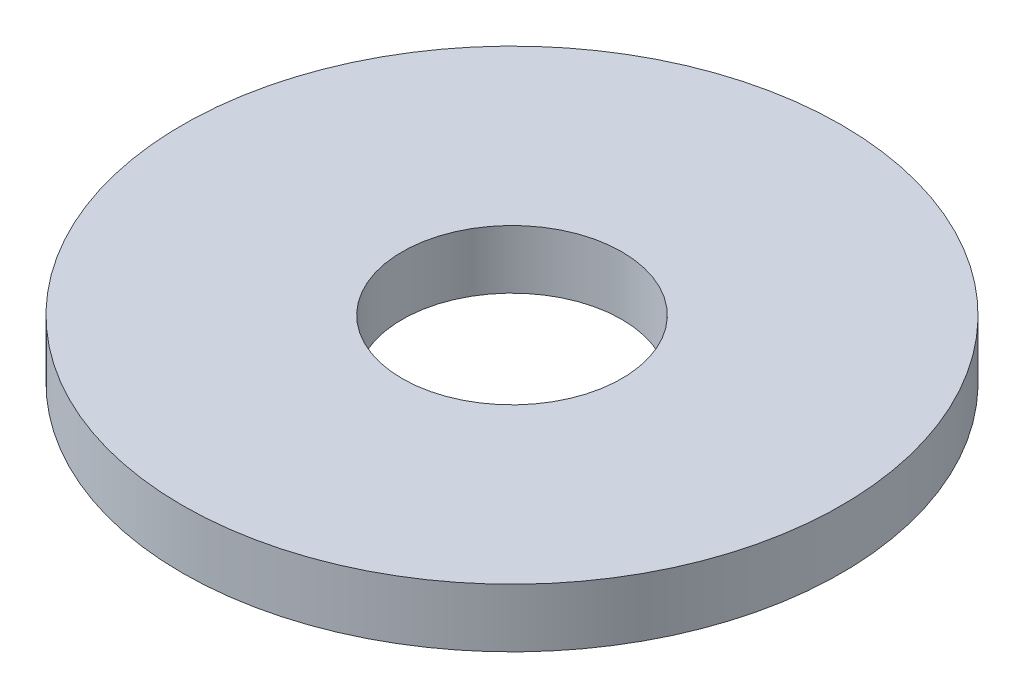
ISO-10303-21;
HEADER;
FILE_DESCRIPTION(('STEP AP214'),'2;1');
FILE_NAME('part.step','',(''),(''),'','','');
FILE_SCHEMA(('AUTOMOTIVE_DESIGN { 1 0 10303 214 1 1 1 1 }'));
ENDSEC;
DATA;
#1=APPLICATION_CONTEXT('core data for automotive mechanical design processes');
#2=APPLICATION_PROTOCOL_DEFINITION('international standard','automotive_design',2000,#1);
#3=PRODUCT_CONTEXT('',#1,'mechanical');
#4=PRODUCT('Part','Part','',(#3));
#5=PRODUCT_RELATED_PRODUCT_CATEGORY('part','',(#4));
#6=PRODUCT_DEFINITION_FORMATION('','',#4);
#7=PRODUCT_DEFINITION_CONTEXT('part definition',#1,'design');
#8=PRODUCT_DEFINITION('design','',#6,#7);
#9=PRODUCT_DEFINITION_SHAPE('','',#8);
#10=(LENGTH_UNIT() NAMED_UNIT(*) SI_UNIT(.MILLI.,.METRE.));
#11=(NAMED_UNIT(*) PLANE_ANGLE_UNIT() SI_UNIT($,.RADIAN.));
#12=(NAMED_UNIT(*) SI_UNIT($,.STERADIAN.) SOLID_ANGLE_UNIT());
#13=UNCERTAINTY_MEASURE_WITH_UNIT(LENGTH_MEASURE(1.E-05),#10,'distance_accuracy_value','');
#14=(GEOMETRIC_REPRESENTATION_CONTEXT(3) GLOBAL_UNCERTAINTY_ASSIGNED_CONTEXT((#13)) GLOBAL_UNIT_ASSIGNED_CONTEXT((#10,
#11,#12)) REPRESENTATION_CONTEXT('',''));
#15=CARTESIAN_POINT('',(0.,0.,0.));
#16=DIRECTION('',(0.,0.,1.));
#17=DIRECTION('',(1.,0.,0.));
#18=AXIS2_PLACEMENT_3D('',#15,#16,#17);
#19=CARTESIAN_POINT('',(0.,1.6,0.));
#20=DIRECTION('',(0.,1.,0.));
#21=DIRECTION('',(0.,0.,1.));
#22=AXIS2_PLACEMENT_3D('',#19,#20,#21);
#23=PLANE('',#22);
#24=CARTESIAN_POINT('',(0.,1.6,0.));
#25=DIRECTION('',(0.,1.,0.));
#26=DIRECTION('',(0.,0.,1.));
#27=AXIS2_PLACEMENT_3D('',#24,#25,#26);
#28=CIRCLE('',#27,9.);
#29=CARTESIAN_POINT('',(0.,1.6,9.));
#30=VERTEX_POINT('',#29);
#31=EDGE_CURVE('E10',#30,#30,#28,.T.);
#32=ORIENTED_EDGE('',*,*,#31,.T.);
#33=EDGE_LOOP('',(#32));
#34=FACE_BOUND('',#33,.T.);
#35=CARTESIAN_POINT('',(0.,1.6,0.));
#36=DIRECTION('',(0.,1.,0.));
#37=DIRECTION('',(0.,0.,1.));
#38=AXIS2_PLACEMENT_3D('',#35,#36,#37);
#39=CIRCLE('',#38,3.);
#40=CARTESIAN_POINT('',(0.,1.6,3.));
#41=VERTEX_POINT('',#40);
#42=EDGE_CURVE('E43',#41,#41,#39,.T.);
#43=ORIENTED_EDGE('',*,*,#42,.F.);
#44=EDGE_LOOP('',(#43));
#45=FACE_BOUND('',#44,.T.);
#46=ADVANCED_FACE('F32',(#34,#45),#23,.T.);
#47=CARTESIAN_POINT('',(0.,0.,0.));
#48=DIRECTION('',(0.,1.,0.));
#49=DIRECTION('',(0.,0.,1.));
#50=AXIS2_PLACEMENT_3D('',#47,#48,#49);
#51=PLANE('',#50);
#52=CARTESIAN_POINT('',(0.,0.,0.));
#53=DIRECTION('',(0.,1.,0.));
#54=DIRECTION('',(0.,0.,1.));
#55=AXIS2_PLACEMENT_3D('',#52,#53,#54);
#56=CIRCLE('',#55,9.);
#57=CARTESIAN_POINT('',(0.,0.,9.));
#58=VERTEX_POINT('',#57);
#59=EDGE_CURVE('E36',#58,#58,#56,.T.);
#60=ORIENTED_EDGE('',*,*,#59,.F.);
#61=EDGE_LOOP('',(#60));
#62=FACE_BOUND('',#61,.T.);
#63=CARTESIAN_POINT('',(0.,0.,0.));
#64=DIRECTION('',(0.,1.,0.));
#65=DIRECTION('',(0.,0.,1.));
#66=AXIS2_PLACEMENT_3D('',#63,#64,#65);
#67=CIRCLE('',#66,3.);
#68=CARTESIAN_POINT('',(0.,0.,3.));
#69=VERTEX_POINT('',#68);
#70=EDGE_CURVE('E45',#69,#69,#67,.T.);
#71=ORIENTED_EDGE('',*,*,#70,.T.);
#72=EDGE_LOOP('',(#71));
#73=FACE_BOUND('',#72,.T.);
#74=ADVANCED_FACE('F55',(#62,#73),#51,.F.);
#75=CARTESIAN_POINT('',(0.,1.6,0.));
#76=DIRECTION('',(0.,-1.,0.));
#77=DIRECTION('',(0.,0.,-1.));
#78=AXIS2_PLACEMENT_3D('',#75,#76,#77);
#79=CYLINDRICAL_SURFACE('',#78,9.);
#80=ORIENTED_EDGE('',*,*,#31,.F.);
#81=EDGE_LOOP('',(#80));
#82=FACE_BOUND('',#81,.T.);
#83=ORIENTED_EDGE('',*,*,#59,.T.);
#84=EDGE_LOOP('',(#83));
#85=FACE_BOUND('',#84,.T.);
#86=ADVANCED_FACE('F34',(#82,#85),#79,.T.);
#87=CARTESIAN_POINT('',(0.,1.6,0.));
#88=DIRECTION('',(0.,-1.,0.));
#89=DIRECTION('',(0.,0.,-1.));
#90=AXIS2_PLACEMENT_3D('',#87,#88,#89);
#91=CYLINDRICAL_SURFACE('',#90,3.);
#92=ORIENTED_EDGE('',*,*,#42,.T.);
#93=EDGE_LOOP('',(#92));
#94=FACE_BOUND('',#93,.T.);
#95=ORIENTED_EDGE('',*,*,#70,.F.);
#96=EDGE_LOOP('',(#95));
#97=FACE_BOUND('',#96,.T.);
#98=ADVANCED_FACE('F51',(#94,#97),#91,.F.);
#99=CLOSED_SHELL('',(#46,#74,#86,#98));
#100=MANIFOLD_SOLID_BREP('B2',#99);
#101=ADVANCED_BREP_SHAPE_REPRESENTATION('',(#18,#100),#14);
#102=SHAPE_DEFINITION_REPRESENTATION(#9,#101);
ENDSEC;
END-ISO-10303-21;
